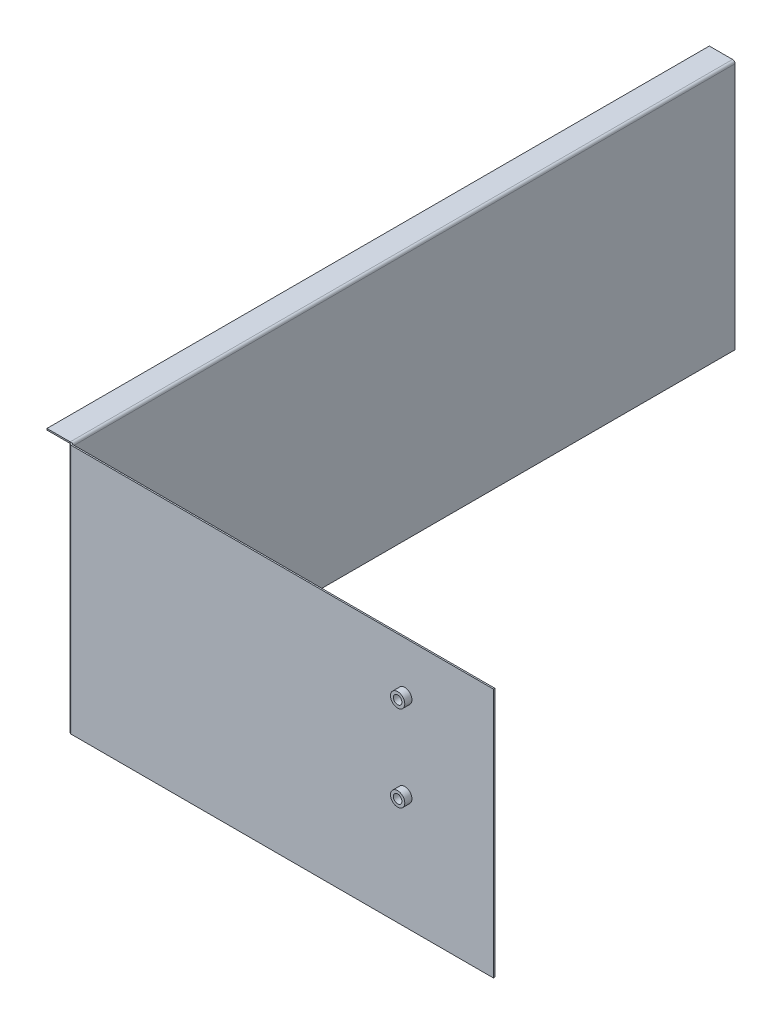
ISO-10303-21;
HEADER;
FILE_DESCRIPTION(('STEP AP214'),'2;1');
FILE_NAME('part.step','',(''),(''),'','','');
FILE_SCHEMA(('AUTOMOTIVE_DESIGN { 1 0 10303 214 1 1 1 1 }'));
ENDSEC;
DATA;
#1=APPLICATION_CONTEXT('core data for automotive mechanical design processes');
#2=APPLICATION_PROTOCOL_DEFINITION('international standard','automotive_design',2000,#1);
#3=PRODUCT_CONTEXT('',#1,'mechanical');
#4=PRODUCT('Part','Part','',(#3));
#5=PRODUCT_RELATED_PRODUCT_CATEGORY('part','',(#4));
#6=PRODUCT_DEFINITION_FORMATION('','',#4);
#7=PRODUCT_DEFINITION_CONTEXT('part definition',#1,'design');
#8=PRODUCT_DEFINITION('design','',#6,#7);
#9=PRODUCT_DEFINITION_SHAPE('','',#8);
#10=(LENGTH_UNIT() NAMED_UNIT(*) SI_UNIT(.MILLI.,.METRE.));
#11=(NAMED_UNIT(*) PLANE_ANGLE_UNIT() SI_UNIT($,.RADIAN.));
#12=(NAMED_UNIT(*) SI_UNIT($,.STERADIAN.) SOLID_ANGLE_UNIT());
#13=UNCERTAINTY_MEASURE_WITH_UNIT(LENGTH_MEASURE(1.E-05),#10,'distance_accuracy_value','');
#14=(GEOMETRIC_REPRESENTATION_CONTEXT(3) GLOBAL_UNCERTAINTY_ASSIGNED_CONTEXT((#13)) GLOBAL_UNIT_ASSIGNED_CONTEXT((#10,
#11,#12)) REPRESENTATION_CONTEXT('',''));
#15=CARTESIAN_POINT('',(0.,0.,0.));
#16=DIRECTION('',(0.,0.,1.));
#17=DIRECTION('',(1.,0.,0.));
#18=AXIS2_PLACEMENT_3D('',#15,#16,#17);
#19=CARTESIAN_POINT('',(-148.500000000001,85.7634,-1.73659999999998));
#20=DIRECTION('',(0.,0.,-1.));
#21=DIRECTION('',(0.,1.,0.));
#22=AXIS2_PLACEMENT_3D('',#19,#20,#21);
#23=PLANE('',#22);
#24=DIRECTION('',(0.,-1.,0.));
#25=VECTOR('',#24,1.);
#26=CARTESIAN_POINT('',(-147.5,-87.5,-1.7366));
#27=LINE('',#26,#25);
#28=CARTESIAN_POINT('',(-147.5,85.7634,-1.73659999999998));
#29=VERTEX_POINT('',#28);
#30=CARTESIAN_POINT('',(-147.5,87.5,-1.7366));
#31=VERTEX_POINT('',#30);
#32=EDGE_CURVE('E269',#29,#31,#27,.F.);
#33=ORIENTED_EDGE('',*,*,#32,.F.);
#34=CARTESIAN_POINT('',(-149.236600000001,85.7634,-1.73659999999998));
#35=DIRECTION('',(0.,0.,-1.));
#36=DIRECTION('',(-1.,0.,0.));
#37=AXIS2_PLACEMENT_3D('',#34,#35,#36);
#38=CIRCLE('',#37,1.7366);
#39=CARTESIAN_POINT('',(-148.5,87.3360410906494,-1.7366));
#40=VERTEX_POINT('',#39);
#41=EDGE_CURVE('E228',#29,#40,#38,.F.);
#42=ORIENTED_EDGE('',*,*,#41,.T.);
#43=DIRECTION('',(4.79481324697032E-13,1.,0.));
#44=VECTOR('',#43,1.);
#45=CARTESIAN_POINT('',(-148.500000000001,85.7634,-1.73659999999998));
#46=LINE('',#45,#44);
#47=CARTESIAN_POINT('',(-148.5,87.5,-1.7366));
#48=VERTEX_POINT('',#47);
#49=EDGE_CURVE('E243',#40,#48,#46,.T.);
#50=ORIENTED_EDGE('',*,*,#49,.T.);
#51=DIRECTION('',(-1.,0.,0.));
#52=VECTOR('',#51,1.);
#53=CARTESIAN_POINT('',(-147.5,87.5,-1.7366));
#54=LINE('',#53,#52);
#55=EDGE_CURVE('E263',#31,#48,#54,.T.);
#56=ORIENTED_EDGE('',*,*,#55,.F.);
#57=EDGE_LOOP('',(#33,#42,#50,#56));
#58=FACE_BOUND('',#57,.T.);
#59=ADVANCED_FACE('F77',(#58),#23,.T.);
#60=CARTESIAN_POINT('',(-148.5,0.,5.18704353703955E-13));
#61=DIRECTION('',(-1.,0.,0.));
#62=DIRECTION('',(0.,0.,1.));
#63=AXIS2_PLACEMENT_3D('',#60,#61,#62);
#64=PLANE('',#63);
#65=CARTESIAN_POINT('',(-148.500000000001,78.4538669843767,-402.606868807182));
#66=DIRECTION('',(-1.,0.,0.));
#67=DIRECTION('',(0.,0.,1.));
#68=AXIS2_PLACEMENT_3D('',#65,#66,#67);
#69=CIRCLE('',#68,4.79400000000002);
#70=CARTESIAN_POINT('',(-148.500000000001,78.4538669843767,-397.812868807182));
#71=VERTEX_POINT('',#70);
#72=EDGE_CURVE('E397',#71,#71,#69,.T.);
#73=ORIENTED_EDGE('',*,*,#72,.F.);
#74=EDGE_LOOP('',(#73));
#75=FACE_BOUND('',#74,.T.);
#76=CARTESIAN_POINT('',(-148.500000000001,78.4538669843767,-292.599468807182));
#77=DIRECTION('',(-1.,0.,0.));
#78=DIRECTION('',(0.,0.,1.));
#79=AXIS2_PLACEMENT_3D('',#76,#77,#78);
#80=CIRCLE('',#79,4.79399999999996);
#81=CARTESIAN_POINT('',(-148.500000000001,78.4538669843767,-287.805468807182));
#82=VERTEX_POINT('',#81);
#83=EDGE_CURVE('E388',#82,#82,#80,.T.);
#84=ORIENTED_EDGE('',*,*,#83,.F.);
#85=EDGE_LOOP('',(#84));
#86=FACE_BOUND('',#85,.T.);
#87=CARTESIAN_POINT('',(-148.500000000001,78.4538669843767,-182.592068807182));
#88=DIRECTION('',(-1.,0.,0.));
#89=DIRECTION('',(0.,0.,1.));
#90=AXIS2_PLACEMENT_3D('',#87,#88,#89);
#91=CIRCLE('',#90,4.79399999999999);
#92=CARTESIAN_POINT('',(-148.500000000001,78.4538669843767,-177.798068807182));
#93=VERTEX_POINT('',#92);
#94=EDGE_CURVE('E379',#93,#93,#91,.T.);
#95=ORIENTED_EDGE('',*,*,#94,.F.);
#96=EDGE_LOOP('',(#95));
#97=FACE_BOUND('',#96,.T.);
#98=CARTESIAN_POINT('',(-148.5,78.4538669843767,-72.5846688071817));
#99=DIRECTION('',(-1.,0.,0.));
#100=DIRECTION('',(0.,0.,1.));
#101=AXIS2_PLACEMENT_3D('',#98,#99,#100);
#102=CIRCLE('',#101,4.79400000000001);
#103=CARTESIAN_POINT('',(-148.5,78.4538669843767,-67.7906688071817));
#104=VERTEX_POINT('',#103);
#105=EDGE_CURVE('E370',#104,#104,#102,.T.);
#106=ORIENTED_EDGE('',*,*,#105,.F.);
#107=EDGE_LOOP('',(#106));
#108=FACE_BOUND('',#107,.T.);
#109=DIRECTION('',(0.,1.,0.));
#110=VECTOR('',#109,1.);
#111=CARTESIAN_POINT('',(-148.5,0.,-1.7366));
#112=LINE('',#111,#110);
#113=CARTESIAN_POINT('',(-148.5,-87.5,-1.7366));
#114=VERTEX_POINT('',#113);
#115=CARTESIAN_POINT('',(-148.500000000001,85.7634,-1.73659999999998));
#116=VERTEX_POINT('',#115);
#117=EDGE_CURVE('E260',#114,#116,#112,.T.);
#118=ORIENTED_EDGE('',*,*,#117,.T.);
#119=DIRECTION('',(0.,0.,-1.));
#120=VECTOR('',#119,1.);
#121=CARTESIAN_POINT('',(-148.500000000001,85.7634,-465.));
#122=LINE('',#121,#120);
#123=CARTESIAN_POINT('',(-148.500000000001,85.7634,-465.));
#124=VERTEX_POINT('',#123);
#125=EDGE_CURVE('E236',#124,#116,#122,.F.);
#126=ORIENTED_EDGE('',*,*,#125,.F.);
#127=DIRECTION('',(0.,1.,0.));
#128=VECTOR('',#127,1.);
#129=CARTESIAN_POINT('',(-148.500000000002,87.5,-465.));
#130=LINE('',#129,#128);
#131=CARTESIAN_POINT('',(-148.500000000002,-87.4999999999999,-465.));
#132=VERTEX_POINT('',#131);
#133=EDGE_CURVE('E252',#132,#124,#130,.T.);
#134=ORIENTED_EDGE('',*,*,#133,.F.);
#135=DIRECTION('',(0.,0.,-1.));
#136=VECTOR('',#135,1.);
#137=CARTESIAN_POINT('',(-148.500000000002,-87.4999999999999,-465.));
#138=LINE('',#137,#136);
#139=EDGE_CURVE('E254',#114,#132,#138,.T.);
#140=ORIENTED_EDGE('',*,*,#139,.F.);
#141=EDGE_LOOP('',(#118,#126,#134,#140));
#142=FACE_BOUND('',#141,.T.);
#143=ADVANCED_FACE('F351',(#75,#86,#97,#108,#142),#64,.T.);
#144=CARTESIAN_POINT('',(-147.5,0.,5.15212872365112E-13));
#145=DIRECTION('',(-1.,0.,0.));
#146=DIRECTION('',(0.,0.,1.));
#147=AXIS2_PLACEMENT_3D('',#144,#145,#146);
#148=PLANE('',#147);
#149=DIRECTION('',(0.,0.,-1.));
#150=VECTOR('',#149,1.);
#151=CARTESIAN_POINT('',(-147.500000000001,85.7634,-465.));
#152=LINE('',#151,#150);
#153=CARTESIAN_POINT('',(-147.500000000002,85.7634,-465.));
#154=VERTEX_POINT('',#153);
#155=EDGE_CURVE('E223',#154,#29,#152,.F.);
#156=ORIENTED_EDGE('',*,*,#155,.T.);
#157=CARTESIAN_POINT('',(-147.5,-87.5,-1.7366));
#158=VERTEX_POINT('',#157);
#159=EDGE_CURVE('E266',#158,#29,#27,.F.);
#160=ORIENTED_EDGE('',*,*,#159,.F.);
#161=DIRECTION('',(0.,0.,1.));
#162=VECTOR('',#161,1.);
#163=CARTESIAN_POINT('',(-147.5,-87.5,5.04744713458355E-13));
#164=LINE('',#163,#162);
#165=CARTESIAN_POINT('',(-147.500000000002,-87.4999999999999,-465.));
#166=VERTEX_POINT('',#165);
#167=EDGE_CURVE('E258',#158,#166,#164,.F.);
#168=ORIENTED_EDGE('',*,*,#167,.T.);
#169=DIRECTION('',(0.,-1.,0.));
#170=VECTOR('',#169,1.);
#171=CARTESIAN_POINT('',(-147.500000000002,0.,-465.));
#172=LINE('',#171,#170);
#173=EDGE_CURVE('E256',#166,#154,#172,.F.);
#174=ORIENTED_EDGE('',*,*,#173,.T.);
#175=EDGE_LOOP('',(#156,#160,#168,#174));
#176=FACE_BOUND('',#175,.T.);
#177=ADVANCED_FACE('F447',(#176),#148,.F.);
#178=CARTESIAN_POINT('',(-148.500000000002,87.5,-465.));
#179=DIRECTION('',(0.,0.,-1.));
#180=DIRECTION('',(-1.,0.,0.));
#181=AXIS2_PLACEMENT_3D('',#178,#179,#180);
#182=PLANE('',#181);
#183=ORIENTED_EDGE('',*,*,#133,.T.);
#184=DIRECTION('',(1.,0.,0.));
#185=VECTOR('',#184,1.);
#186=CARTESIAN_POINT('',(-148.500000000001,85.7634,-465.));
#187=LINE('',#186,#185);
#188=EDGE_CURVE('E92',#124,#154,#187,.T.);
#189=ORIENTED_EDGE('',*,*,#188,.T.);
#190=ORIENTED_EDGE('',*,*,#173,.F.);
#191=DIRECTION('',(1.,0.,0.));
#192=VECTOR('',#191,1.);
#193=CARTESIAN_POINT('',(-148.500000000002,-87.4999999999999,-465.));
#194=LINE('',#193,#192);
#195=EDGE_CURVE('E248',#132,#166,#194,.T.);
#196=ORIENTED_EDGE('',*,*,#195,.F.);
#197=EDGE_LOOP('',(#183,#189,#190,#196));
#198=FACE_BOUND('',#197,.T.);
#199=ADVANCED_FACE('F458',(#198),#182,.T.);
#200=CARTESIAN_POINT('',(-148.5,87.5,-1.));
#201=DIRECTION('',(0.,1.,0.));
#202=DIRECTION('',(0.,0.,1.));
#203=AXIS2_PLACEMENT_3D('',#200,#201,#202);
#204=PLANE('',#203);
#205=DIRECTION('',(-1.,0.,0.));
#206=VECTOR('',#205,1.);
#207=CARTESIAN_POINT('',(-148.5,87.5,-1.));
#208=LINE('',#207,#206);
#209=CARTESIAN_POINT('',(148.5,87.5,-1.));
#210=VERTEX_POINT('',#209);
#211=CARTESIAN_POINT('',(-146.7634,87.5,-1.));
#212=VERTEX_POINT('',#211);
#213=EDGE_CURVE('E295',#210,#212,#208,.T.);
#214=ORIENTED_EDGE('',*,*,#213,.T.);
#215=DIRECTION('',(0.,0.,1.));
#216=VECTOR('',#215,1.);
#217=CARTESIAN_POINT('',(-146.7634,87.5,-1.));
#218=LINE('',#217,#216);
#219=CARTESIAN_POINT('',(-146.7634,87.5,0.));
#220=VERTEX_POINT('',#219);
#221=EDGE_CURVE('E278',#212,#220,#218,.T.);
#222=ORIENTED_EDGE('',*,*,#221,.T.);
#223=DIRECTION('',(-1.,0.,0.));
#224=VECTOR('',#223,1.);
#225=CARTESIAN_POINT('',(-148.5,87.5,0.));
#226=LINE('',#225,#224);
#227=CARTESIAN_POINT('',(148.5,87.5,0.));
#228=VERTEX_POINT('',#227);
#229=EDGE_CURVE('E303',#228,#220,#226,.T.);
#230=ORIENTED_EDGE('',*,*,#229,.F.);
#231=DIRECTION('',(0.,0.,1.));
#232=VECTOR('',#231,1.);
#233=CARTESIAN_POINT('',(148.5,87.5,-1.));
#234=LINE('',#233,#232);
#235=EDGE_CURVE('E300',#210,#228,#234,.T.);
#236=ORIENTED_EDGE('',*,*,#235,.F.);
#237=EDGE_LOOP('',(#214,#222,#230,#236));
#238=FACE_BOUND('',#237,.T.);
#239=ADVANCED_FACE('F462',(#238),#204,.T.);
#240=CARTESIAN_POINT('',(0.,0.,-1.));
#241=DIRECTION('',(0.,0.,-1.));
#242=DIRECTION('',(-1.,0.,0.));
#243=AXIS2_PLACEMENT_3D('',#240,#241,#242);
#244=PLANE('',#243);
#245=DIRECTION('',(1.,0.,0.));
#246=VECTOR('',#245,1.);
#247=CARTESIAN_POINT('',(-148.5,-87.5,-1.));
#248=LINE('',#247,#246);
#249=CARTESIAN_POINT('',(-146.7634,-87.5,-1.));
#250=VERTEX_POINT('',#249);
#251=CARTESIAN_POINT('',(148.5,-87.5,-1.));
#252=VERTEX_POINT('',#251);
#253=EDGE_CURVE('E298',#250,#252,#248,.T.);
#254=ORIENTED_EDGE('',*,*,#253,.F.);
#255=DIRECTION('',(0.,1.,0.));
#256=VECTOR('',#255,1.);
#257=CARTESIAN_POINT('',(-146.7634,87.5,-1.));
#258=LINE('',#257,#256);
#259=EDGE_CURVE('E100',#212,#250,#258,.F.);
#260=ORIENTED_EDGE('',*,*,#259,.F.);
#261=ORIENTED_EDGE('',*,*,#213,.F.);
#262=DIRECTION('',(0.,1.,0.));
#263=VECTOR('',#262,1.);
#264=CARTESIAN_POINT('',(148.5,-87.5,-1.));
#265=LINE('',#264,#263);
#266=EDGE_CURVE('E292',#252,#210,#265,.T.);
#267=ORIENTED_EDGE('',*,*,#266,.F.);
#268=EDGE_LOOP('',(#254,#260,#261,#267));
#269=FACE_BOUND('',#268,.T.);
#270=ADVANCED_FACE('F330',(#269),#244,.T.);
#271=CARTESIAN_POINT('',(0.,0.,0.));
#272=DIRECTION('',(0.,0.,-1.));
#273=DIRECTION('',(-1.,0.,0.));
#274=AXIS2_PLACEMENT_3D('',#271,#272,#273);
#275=PLANE('',#274);
#276=CARTESIAN_POINT('',(86.5,-7.50000000000001,0.));
#277=DIRECTION('',(0.,0.,-1.));
#278=DIRECTION('',(-1.,0.,0.));
#279=AXIS2_PLACEMENT_3D('',#276,#277,#278);
#280=CIRCLE('',#279,5.);
#281=CARTESIAN_POINT('',(81.5,-7.50000000000001,0.));
#282=VERTEX_POINT('',#281);
#283=EDGE_CURVE('E13',#282,#282,#280,.F.);
#284=ORIENTED_EDGE('',*,*,#283,.F.);
#285=EDGE_LOOP('',(#284));
#286=FACE_BOUND('',#285,.T.);
#287=CARTESIAN_POINT('',(86.5,52.5,0.));
#288=DIRECTION('',(0.,0.,-1.));
#289=DIRECTION('',(-1.,0.,0.));
#290=AXIS2_PLACEMENT_3D('',#287,#288,#289);
#291=CIRCLE('',#290,5.00000000000001);
#292=CARTESIAN_POINT('',(81.5,52.5,0.));
#293=VERTEX_POINT('',#292);
#294=EDGE_CURVE('E85',#293,#293,#291,.F.);
#295=ORIENTED_EDGE('',*,*,#294,.F.);
#296=EDGE_LOOP('',(#295));
#297=FACE_BOUND('',#296,.T.);
#298=DIRECTION('',(0.,1.,0.));
#299=VECTOR('',#298,1.);
#300=CARTESIAN_POINT('',(-146.7634,87.5,0.));
#301=LINE('',#300,#299);
#302=CARTESIAN_POINT('',(-146.7634,-87.5,0.));
#303=VERTEX_POINT('',#302);
#304=EDGE_CURVE('E272',#220,#303,#301,.F.);
#305=ORIENTED_EDGE('',*,*,#304,.T.);
#306=DIRECTION('',(1.,0.,0.));
#307=VECTOR('',#306,1.);
#308=CARTESIAN_POINT('',(-148.5,-87.5,0.));
#309=LINE('',#308,#307);
#310=CARTESIAN_POINT('',(148.5,-87.5,0.));
#311=VERTEX_POINT('',#310);
#312=EDGE_CURVE('E296',#303,#311,#309,.T.);
#313=ORIENTED_EDGE('',*,*,#312,.T.);
#314=DIRECTION('',(0.,1.,0.));
#315=VECTOR('',#314,1.);
#316=CARTESIAN_POINT('',(148.5,-87.5,0.));
#317=LINE('',#316,#315);
#318=EDGE_CURVE('E290',#311,#228,#317,.T.);
#319=ORIENTED_EDGE('',*,*,#318,.T.);
#320=ORIENTED_EDGE('',*,*,#229,.T.);
#321=EDGE_LOOP('',(#305,#313,#319,#320));
#322=FACE_BOUND('',#321,.T.);
#323=ADVANCED_FACE('F327',(#286,#297,#322),#275,.F.);
#324=CARTESIAN_POINT('',(148.5,-87.5,-1.));
#325=DIRECTION('',(1.,0.,0.));
#326=DIRECTION('',(0.,0.,-1.));
#327=AXIS2_PLACEMENT_3D('',#324,#325,#326);
#328=PLANE('',#327);
#329=ORIENTED_EDGE('',*,*,#318,.F.);
#330=DIRECTION('',(0.,0.,1.));
#331=VECTOR('',#330,1.);
#332=CARTESIAN_POINT('',(148.5,-87.5,-1.));
#333=LINE('',#332,#331);
#334=EDGE_CURVE('E307',#252,#311,#333,.T.);
#335=ORIENTED_EDGE('',*,*,#334,.F.);
#336=ORIENTED_EDGE('',*,*,#266,.T.);
#337=ORIENTED_EDGE('',*,*,#235,.T.);
#338=EDGE_LOOP('',(#329,#335,#336,#337));
#339=FACE_BOUND('',#338,.T.);
#340=ADVANCED_FACE('F79',(#339),#328,.T.);
#341=CARTESIAN_POINT('',(-148.5,-87.5,-1.));
#342=DIRECTION('',(0.,-1.,0.));
#343=DIRECTION('',(0.,0.,-1.));
#344=AXIS2_PLACEMENT_3D('',#341,#342,#343);
#345=PLANE('',#344);
#346=DIRECTION('',(0.,0.,1.));
#347=VECTOR('',#346,1.);
#348=CARTESIAN_POINT('',(-146.7634,-87.5,-1.));
#349=LINE('',#348,#347);
#350=EDGE_CURVE('E287',#250,#303,#349,.T.);
#351=ORIENTED_EDGE('',*,*,#350,.F.);
#352=ORIENTED_EDGE('',*,*,#253,.T.);
#353=ORIENTED_EDGE('',*,*,#334,.T.);
#354=ORIENTED_EDGE('',*,*,#312,.F.);
#355=EDGE_LOOP('',(#351,#352,#353,#354));
#356=FACE_BOUND('',#355,.T.);
#357=ADVANCED_FACE('F342',(#356),#345,.T.);
#358=CARTESIAN_POINT('',(-146.7634,-87.5,-1.73660000000001));
#359=DIRECTION('',(0.,-1.,0.));
#360=DIRECTION('',(0.,0.,-1.));
#361=AXIS2_PLACEMENT_3D('',#358,#359,#360);
#362=PLANE('',#361);
#363=DIRECTION('',(-1.,0.,0.));
#364=VECTOR('',#363,1.);
#365=CARTESIAN_POINT('',(-148.5,-87.5,-1.73660000000003));
#366=LINE('',#365,#364);
#367=EDGE_CURVE('E247',#158,#114,#366,.T.);
#368=ORIENTED_EDGE('',*,*,#367,.F.);
#369=CARTESIAN_POINT('',(-146.7634,-87.5,-1.73660000000001));
#370=DIRECTION('',(0.,1.,0.));
#371=DIRECTION('',(0.,0.,1.));
#372=AXIS2_PLACEMENT_3D('',#369,#370,#371);
#373=CIRCLE('',#372,0.736600000000004);
#374=EDGE_CURVE('E281',#250,#158,#373,.F.);
#375=ORIENTED_EDGE('',*,*,#374,.F.);
#376=ORIENTED_EDGE('',*,*,#350,.T.);
#377=CARTESIAN_POINT('',(-146.7634,-87.5,-1.73660000000001));
#378=DIRECTION('',(0.,1.,0.));
#379=DIRECTION('',(0.,0.,1.));
#380=AXIS2_PLACEMENT_3D('',#377,#378,#379);
#381=CIRCLE('',#380,1.7366);
#382=EDGE_CURVE('E274',#303,#114,#381,.F.);
#383=ORIENTED_EDGE('',*,*,#382,.T.);
#384=EDGE_LOOP('',(#368,#375,#376,#383));
#385=FACE_BOUND('',#384,.T.);
#386=ADVANCED_FACE('F347',(#385),#362,.T.);
#387=CARTESIAN_POINT('',(-146.7634,87.5,-1.73660000000001));
#388=DIRECTION('',(0.,-1.,0.));
#389=DIRECTION('',(0.,0.,-1.));
#390=AXIS2_PLACEMENT_3D('',#387,#388,#389);
#391=PLANE('',#390);
#392=CARTESIAN_POINT('',(-146.7634,87.5,-1.73660000000001));
#393=DIRECTION('',(0.,1.,0.));
#394=DIRECTION('',(0.,0.,1.));
#395=AXIS2_PLACEMENT_3D('',#392,#393,#394);
#396=CIRCLE('',#395,0.736600000000004);
#397=EDGE_CURVE('E251',#31,#212,#396,.T.);
#398=ORIENTED_EDGE('',*,*,#397,.F.);
#399=ORIENTED_EDGE('',*,*,#55,.T.);
#400=CARTESIAN_POINT('',(-146.7634,87.5,-1.73660000000001));
#401=DIRECTION('',(0.,1.,0.));
#402=DIRECTION('',(0.,0.,1.));
#403=AXIS2_PLACEMENT_3D('',#400,#401,#402);
#404=CIRCLE('',#403,1.7366);
#405=EDGE_CURVE('E275',#48,#220,#404,.T.);
#406=ORIENTED_EDGE('',*,*,#405,.T.);
#407=ORIENTED_EDGE('',*,*,#221,.F.);
#408=EDGE_LOOP('',(#398,#399,#406,#407));
#409=FACE_BOUND('',#408,.T.);
#410=ADVANCED_FACE('F470',(#409),#391,.F.);
#411=CARTESIAN_POINT('',(-146.7634,87.5,-1.73660000000001));
#412=DIRECTION('',(0.,1.,0.));
#413=DIRECTION('',(-1.,0.,0.));
#414=AXIS2_PLACEMENT_3D('',#411,#412,#413);
#415=CYLINDRICAL_SURFACE('',#414,1.7366);
#416=ORIENTED_EDGE('',*,*,#304,.F.);
#417=ORIENTED_EDGE('',*,*,#405,.F.);
#418=ORIENTED_EDGE('',*,*,#49,.F.);
#419=EDGE_CURVE('E244',#116,#40,#46,.T.);
#420=ORIENTED_EDGE('',*,*,#419,.F.);
#421=ORIENTED_EDGE('',*,*,#117,.F.);
#422=ORIENTED_EDGE('',*,*,#382,.F.);
#423=EDGE_LOOP('',(#416,#417,#418,#420,#421,#422));
#424=FACE_BOUND('',#423,.T.);
#425=ADVANCED_FACE('F348',(#424),#415,.T.);
#426=CARTESIAN_POINT('',(-146.7634,87.5,-1.73660000000001));
#427=DIRECTION('',(0.,1.,0.));
#428=DIRECTION('',(-1.,0.,0.));
#429=AXIS2_PLACEMENT_3D('',#426,#427,#428);
#430=CYLINDRICAL_SURFACE('',#429,0.736600000000004);
#431=ORIENTED_EDGE('',*,*,#259,.T.);
#432=ORIENTED_EDGE('',*,*,#374,.T.);
#433=ORIENTED_EDGE('',*,*,#159,.T.);
#434=ORIENTED_EDGE('',*,*,#32,.T.);
#435=ORIENTED_EDGE('',*,*,#397,.T.);
#436=EDGE_LOOP('',(#431,#432,#433,#434,#435));
#437=FACE_BOUND('',#436,.T.);
#438=ADVANCED_FACE('F466',(#437),#430,.F.);
#439=CARTESIAN_POINT('',(-148.500000000002,-87.4999999999999,-465.));
#440=DIRECTION('',(0.,-1.,0.));
#441=DIRECTION('',(0.,0.,-1.));
#442=AXIS2_PLACEMENT_3D('',#439,#440,#441);
#443=PLANE('',#442);
#444=ORIENTED_EDGE('',*,*,#167,.F.);
#445=ORIENTED_EDGE('',*,*,#367,.T.);
#446=ORIENTED_EDGE('',*,*,#139,.T.);
#447=ORIENTED_EDGE('',*,*,#195,.T.);
#448=EDGE_LOOP('',(#444,#445,#446,#447));
#449=FACE_BOUND('',#448,.T.);
#450=ADVANCED_FACE('F463',(#449),#443,.T.);
#451=CARTESIAN_POINT('',(-149.236600000001,85.7634,-1.73659999999998));
#452=DIRECTION('',(0.,0.,1.));
#453=DIRECTION('',(1.,0.,0.));
#454=AXIS2_PLACEMENT_3D('',#451,#452,#453);
#455=PLANE('',#454);
#456=CARTESIAN_POINT('',(-149.236600000001,85.7634,-1.73659999999998));
#457=DIRECTION('',(0.,0.,-1.));
#458=DIRECTION('',(-1.,0.,0.));
#459=AXIS2_PLACEMENT_3D('',#456,#457,#458);
#460=CIRCLE('',#459,0.736600000000004);
#461=CARTESIAN_POINT('',(-149.236600000001,86.5,-1.73659999999998));
#462=VERTEX_POINT('',#461);
#463=EDGE_CURVE('E233',#116,#462,#460,.F.);
#464=ORIENTED_EDGE('',*,*,#463,.F.);
#465=ORIENTED_EDGE('',*,*,#419,.T.);
#466=CARTESIAN_POINT('',(-149.236600000001,87.5,-1.73659999999998));
#467=VERTEX_POINT('',#466);
#468=EDGE_CURVE('E226',#40,#467,#38,.F.);
#469=ORIENTED_EDGE('',*,*,#468,.T.);
#470=DIRECTION('',(0.,-1.,0.));
#471=VECTOR('',#470,1.);
#472=CARTESIAN_POINT('',(-149.2366,87.5,-1.7366));
#473=LINE('',#472,#471);
#474=EDGE_CURVE('E203',#462,#467,#473,.F.);
#475=ORIENTED_EDGE('',*,*,#474,.F.);
#476=EDGE_LOOP('',(#464,#465,#469,#475));
#477=FACE_BOUND('',#476,.T.);
#478=ADVANCED_FACE('F359',(#477),#455,.T.);
#479=CARTESIAN_POINT('',(-149.236600000001,85.7634,-465.));
#480=DIRECTION('',(0.,0.,1.));
#481=DIRECTION('',(1.,0.,0.));
#482=AXIS2_PLACEMENT_3D('',#479,#480,#481);
#483=PLANE('',#482);
#484=CARTESIAN_POINT('',(-149.236600000001,85.7634,-465.));
#485=DIRECTION('',(0.,0.,-1.));
#486=DIRECTION('',(-1.,0.,0.));
#487=AXIS2_PLACEMENT_3D('',#484,#485,#486);
#488=CIRCLE('',#487,0.736600000000004);
#489=CARTESIAN_POINT('',(-149.236600000001,86.5,-465.));
#490=VERTEX_POINT('',#489);
#491=EDGE_CURVE('E239',#490,#124,#488,.T.);
#492=ORIENTED_EDGE('',*,*,#491,.F.);
#493=DIRECTION('',(0.,-1.,0.));
#494=VECTOR('',#493,1.);
#495=CARTESIAN_POINT('',(-149.236600000002,86.5,-465.));
#496=LINE('',#495,#494);
#497=CARTESIAN_POINT('',(-149.236600000002,87.5,-465.));
#498=VERTEX_POINT('',#497);
#499=EDGE_CURVE('E216',#490,#498,#496,.F.);
#500=ORIENTED_EDGE('',*,*,#499,.T.);
#501=CARTESIAN_POINT('',(-149.236600000001,85.7634,-465.));
#502=DIRECTION('',(0.,0.,-1.));
#503=DIRECTION('',(-1.,0.,0.));
#504=AXIS2_PLACEMENT_3D('',#501,#502,#503);
#505=CIRCLE('',#504,1.7366);
#506=EDGE_CURVE('E227',#498,#154,#505,.T.);
#507=ORIENTED_EDGE('',*,*,#506,.T.);
#508=ORIENTED_EDGE('',*,*,#188,.F.);
#509=EDGE_LOOP('',(#492,#500,#507,#508));
#510=FACE_BOUND('',#509,.T.);
#511=ADVANCED_FACE('F453',(#510),#483,.F.);
#512=CARTESIAN_POINT('',(-149.236600000001,85.7634,-465.));
#513=DIRECTION('',(0.,0.,-1.));
#514=DIRECTION('',(0.,1.,0.));
#515=AXIS2_PLACEMENT_3D('',#512,#513,#514);
#516=CYLINDRICAL_SURFACE('',#515,1.7366);
#517=ORIENTED_EDGE('',*,*,#155,.F.);
#518=ORIENTED_EDGE('',*,*,#506,.F.);
#519=DIRECTION('',(0.,0.,-1.));
#520=VECTOR('',#519,1.);
#521=CARTESIAN_POINT('',(-149.2366,87.5,-1.73659999999997));
#522=LINE('',#521,#520);
#523=EDGE_CURVE('E213',#498,#467,#522,.F.);
#524=ORIENTED_EDGE('',*,*,#523,.T.);
#525=ORIENTED_EDGE('',*,*,#468,.F.);
#526=ORIENTED_EDGE('',*,*,#41,.F.);
#527=EDGE_LOOP('',(#517,#518,#524,#525,#526));
#528=FACE_BOUND('',#527,.T.);
#529=ADVANCED_FACE('F364',(#528),#516,.T.);
#530=CARTESIAN_POINT('',(-149.236600000001,85.7634,-465.));
#531=DIRECTION('',(0.,0.,-1.));
#532=DIRECTION('',(0.,1.,0.));
#533=AXIS2_PLACEMENT_3D('',#530,#531,#532);
#534=CYLINDRICAL_SURFACE('',#533,0.736600000000004);
#535=ORIENTED_EDGE('',*,*,#125,.T.);
#536=ORIENTED_EDGE('',*,*,#463,.T.);
#537=DIRECTION('',(0.,0.,-1.));
#538=VECTOR('',#537,1.);
#539=CARTESIAN_POINT('',(-149.2366,86.5,-1.73659999999997));
#540=LINE('',#539,#538);
#541=EDGE_CURVE('E219',#462,#490,#540,.T.);
#542=ORIENTED_EDGE('',*,*,#541,.T.);
#543=ORIENTED_EDGE('',*,*,#491,.T.);
#544=EDGE_LOOP('',(#535,#536,#542,#543));
#545=FACE_BOUND('',#544,.T.);
#546=ADVANCED_FACE('F355',(#545),#534,.F.);
#547=CARTESIAN_POINT('',(-165.500000000002,87.5000000000001,-465.));
#548=DIRECTION('',(0.,0.,1.));
#549=DIRECTION('',(1.,0.,0.));
#550=AXIS2_PLACEMENT_3D('',#547,#548,#549);
#551=PLANE('',#550);
#552=ORIENTED_EDGE('',*,*,#499,.F.);
#553=DIRECTION('',(1.,0.,0.));
#554=VECTOR('',#553,1.);
#555=CARTESIAN_POINT('',(-165.500000000002,86.5,-465.));
#556=LINE('',#555,#554);
#557=CARTESIAN_POINT('',(-165.500000000002,86.5,-465.));
#558=VERTEX_POINT('',#557);
#559=EDGE_CURVE('E211',#490,#558,#556,.F.);
#560=ORIENTED_EDGE('',*,*,#559,.T.);
#561=DIRECTION('',(0.,-1.,0.));
#562=VECTOR('',#561,1.);
#563=CARTESIAN_POINT('',(-165.500000000002,87.5000000000001,-465.));
#564=LINE('',#563,#562);
#565=CARTESIAN_POINT('',(-165.500000000002,87.5000000000001,-465.));
#566=VERTEX_POINT('',#565);
#567=EDGE_CURVE('E199',#566,#558,#564,.T.);
#568=ORIENTED_EDGE('',*,*,#567,.F.);
#569=DIRECTION('',(-1.,0.,0.));
#570=VECTOR('',#569,1.);
#571=CARTESIAN_POINT('',(-1.2291826121788E-12,87.4999999999995,-465.000000000001));
#572=LINE('',#571,#570);
#573=EDGE_CURVE('E186',#498,#566,#572,.T.);
#574=ORIENTED_EDGE('',*,*,#573,.F.);
#575=EDGE_LOOP('',(#552,#560,#568,#574));
#576=FACE_BOUND('',#575,.T.);
#577=ADVANCED_FACE('F367',(#576),#551,.F.);
#578=CARTESIAN_POINT('',(-148.5,87.5,-1.7366));
#579=DIRECTION('',(0.,0.,-1.));
#580=DIRECTION('',(-1.,0.,0.));
#581=AXIS2_PLACEMENT_3D('',#578,#579,#580);
#582=PLANE('',#581);
#583=ORIENTED_EDGE('',*,*,#474,.T.);
#584=DIRECTION('',(1.,0.,0.));
#585=VECTOR('',#584,1.);
#586=CARTESIAN_POINT('',(2.829197898534E-13,87.4999999999995,-1.73660000000054));
#587=LINE('',#586,#585);
#588=CARTESIAN_POINT('',(-165.5,87.5000000000001,-1.73659999999994));
#589=VERTEX_POINT('',#588);
#590=EDGE_CURVE('E184',#589,#467,#587,.T.);
#591=ORIENTED_EDGE('',*,*,#590,.F.);
#592=DIRECTION('',(0.,-1.,0.));
#593=VECTOR('',#592,1.);
#594=CARTESIAN_POINT('',(-165.5,87.5000000000001,-1.73659999999994));
#595=LINE('',#594,#593);
#596=CARTESIAN_POINT('',(-165.5,86.5,-1.73659999999994));
#597=VERTEX_POINT('',#596);
#598=EDGE_CURVE('E192',#589,#597,#595,.T.);
#599=ORIENTED_EDGE('',*,*,#598,.T.);
#600=DIRECTION('',(-1.,0.,0.));
#601=VECTOR('',#600,1.);
#602=CARTESIAN_POINT('',(-148.5,86.5,-1.7366));
#603=LINE('',#602,#601);
#604=EDGE_CURVE('E208',#597,#462,#603,.F.);
#605=ORIENTED_EDGE('',*,*,#604,.T.);
#606=EDGE_LOOP('',(#583,#591,#599,#605));
#607=FACE_BOUND('',#606,.T.);
#608=ADVANCED_FACE('F202',(#607),#582,.F.);
#609=CARTESIAN_POINT('',(2.89210642087962E-13,87.4999999999995,0.));
#610=DIRECTION('',(0.,-1.,0.));
#611=DIRECTION('',(1.,0.,0.));
#612=AXIS2_PLACEMENT_3D('',#609,#610,#611);
#613=PLANE('',#612);
#614=ORIENTED_EDGE('',*,*,#523,.F.);
#615=ORIENTED_EDGE('',*,*,#573,.T.);
#616=DIRECTION('',(0.,0.,1.));
#617=VECTOR('',#616,1.);
#618=CARTESIAN_POINT('',(-165.5,87.5000000000001,5.75106452040938E-13));
#619=LINE('',#618,#617);
#620=EDGE_CURVE('E179',#566,#589,#619,.T.);
#621=ORIENTED_EDGE('',*,*,#620,.T.);
#622=ORIENTED_EDGE('',*,*,#590,.T.);
#623=EDGE_LOOP('',(#614,#615,#621,#622));
#624=FACE_BOUND('',#623,.T.);
#625=ADVANCED_FACE('F182',(#624),#613,.F.);
#626=CARTESIAN_POINT('',(2.85719160749119E-13,86.4999999999995,0.));
#627=DIRECTION('',(0.,-1.,0.));
#628=DIRECTION('',(1.,0.,0.));
#629=AXIS2_PLACEMENT_3D('',#626,#627,#628);
#630=PLANE('',#629);
#631=ORIENTED_EDGE('',*,*,#559,.F.);
#632=ORIENTED_EDGE('',*,*,#541,.F.);
#633=ORIENTED_EDGE('',*,*,#604,.F.);
#634=DIRECTION('',(0.,0.,-1.));
#635=VECTOR('',#634,1.);
#636=CARTESIAN_POINT('',(-165.5,86.5,-1.73659999999994));
#637=LINE('',#636,#635);
#638=EDGE_CURVE('E195',#558,#597,#637,.F.);
#639=ORIENTED_EDGE('',*,*,#638,.F.);
#640=EDGE_LOOP('',(#631,#632,#633,#639));
#641=FACE_BOUND('',#640,.T.);
#642=ADVANCED_FACE('F509',(#641),#630,.T.);
#643=CARTESIAN_POINT('',(-165.5,87.5000000000001,-1.73659999999994));
#644=DIRECTION('',(1.,0.,0.));
#645=DIRECTION('',(0.,1.,0.));
#646=AXIS2_PLACEMENT_3D('',#643,#644,#645);
#647=PLANE('',#646);
#648=ORIENTED_EDGE('',*,*,#638,.T.);
#649=ORIENTED_EDGE('',*,*,#598,.F.);
#650=ORIENTED_EDGE('',*,*,#620,.F.);
#651=ORIENTED_EDGE('',*,*,#567,.T.);
#652=EDGE_LOOP('',(#648,#649,#650,#651));
#653=FACE_BOUND('',#652,.T.);
#654=ADVANCED_FACE('F193',(#653),#647,.F.);
#655=CARTESIAN_POINT('',(-166.5,78.4538669843767,-72.5846688071817));
#656=DIRECTION('',(-1.,0.,0.));
#657=DIRECTION('',(0.,0.,1.));
#658=AXIS2_PLACEMENT_3D('',#655,#656,#657);
#659=PLANE('',#658);
#660=CARTESIAN_POINT('',(-166.5,78.4538669843767,-72.5846688071817));
#661=DIRECTION('',(-1.,0.,0.));
#662=DIRECTION('',(0.,0.,1.));
#663=AXIS2_PLACEMENT_3D('',#660,#661,#662);
#664=CIRCLE('',#663,4.79400000000001);
#665=CARTESIAN_POINT('',(-166.5,78.4538669843767,-67.7906688071817));
#666=VERTEX_POINT('',#665);
#667=EDGE_CURVE('E222',#666,#666,#664,.T.);
#668=ORIENTED_EDGE('',*,*,#667,.T.);
#669=EDGE_LOOP('',(#668));
#670=FACE_BOUND('',#669,.T.);
#671=CARTESIAN_POINT('',(-166.5,78.4538669843767,-72.5846688071817));
#672=DIRECTION('',(-1.,0.,0.));
#673=DIRECTION('',(0.,0.,1.));
#674=AXIS2_PLACEMENT_3D('',#671,#672,#673);
#675=CIRCLE('',#674,2.794);
#676=CARTESIAN_POINT('',(-166.5,78.4538669843767,-69.7906688071817));
#677=VERTEX_POINT('',#676);
#678=EDGE_CURVE('E373',#677,#677,#675,.T.);
#679=ORIENTED_EDGE('',*,*,#678,.F.);
#680=EDGE_LOOP('',(#679));
#681=FACE_BOUND('',#680,.T.);
#682=ADVANCED_FACE('F508',(#670,#681),#659,.T.);
#683=CARTESIAN_POINT('',(-166.5,78.4538669843767,-72.5846688071817));
#684=DIRECTION('',(1.,0.,0.));
#685=DIRECTION('',(0.,0.,-1.));
#686=AXIS2_PLACEMENT_3D('',#683,#684,#685);
#687=CYLINDRICAL_SURFACE('',#686,4.79400000000001);
#688=ORIENTED_EDGE('',*,*,#667,.F.);
#689=EDGE_LOOP('',(#688));
#690=FACE_BOUND('',#689,.T.);
#691=ORIENTED_EDGE('',*,*,#105,.T.);
#692=EDGE_LOOP('',(#691));
#693=FACE_BOUND('',#692,.T.);
#694=ADVANCED_FACE('F517',(#690,#693),#687,.T.);
#695=CARTESIAN_POINT('',(-166.5,78.4538669843767,-72.5846688071817));
#696=DIRECTION('',(1.,0.,0.));
#697=DIRECTION('',(0.,0.,-1.));
#698=AXIS2_PLACEMENT_3D('',#695,#696,#697);
#699=CYLINDRICAL_SURFACE('',#698,2.794);
#700=ORIENTED_EDGE('',*,*,#678,.T.);
#701=EDGE_LOOP('',(#700));
#702=FACE_BOUND('',#701,.T.);
#703=CARTESIAN_POINT('',(-148.5,78.4538669843767,-72.5846688071817));
#704=DIRECTION('',(-1.,0.,0.));
#705=DIRECTION('',(0.,0.,1.));
#706=AXIS2_PLACEMENT_3D('',#703,#704,#705);
#707=CIRCLE('',#706,2.794);
#708=CARTESIAN_POINT('',(-148.5,78.4538669843767,-69.7906688071817));
#709=VERTEX_POINT('',#708);
#710=EDGE_CURVE('E310',#709,#709,#707,.F.);
#711=ORIENTED_EDGE('',*,*,#710,.T.);
#712=EDGE_LOOP('',(#711));
#713=FACE_BOUND('',#712,.T.);
#714=ADVANCED_FACE('F520',(#702,#713),#699,.F.);
#715=ORIENTED_EDGE('',*,*,#710,.F.);
#716=EDGE_LOOP('',(#715));
#717=FACE_BOUND('',#716,.T.);
#718=ADVANCED_FACE('F451',(#717),#64,.T.);
#719=CARTESIAN_POINT('',(-166.500000000001,78.4538669843767,-182.592068807182));
#720=DIRECTION('',(-1.,0.,0.));
#721=DIRECTION('',(0.,0.,1.));
#722=AXIS2_PLACEMENT_3D('',#719,#720,#721);
#723=PLANE('',#722);
#724=CARTESIAN_POINT('',(-166.500000000001,78.4538669843767,-182.592068807182));
#725=DIRECTION('',(-1.,0.,0.));
#726=DIRECTION('',(0.,0.,1.));
#727=AXIS2_PLACEMENT_3D('',#724,#725,#726);
#728=CIRCLE('',#727,4.79399999999999);
#729=CARTESIAN_POINT('',(-166.500000000001,78.4538669843767,-177.798068807182));
#730=VERTEX_POINT('',#729);
#731=EDGE_CURVE('E378',#730,#730,#728,.T.);
#732=ORIENTED_EDGE('',*,*,#731,.T.);
#733=EDGE_LOOP('',(#732));
#734=FACE_BOUND('',#733,.T.);
#735=CARTESIAN_POINT('',(-166.500000000001,78.4538669843767,-182.592068807182));
#736=DIRECTION('',(-1.,0.,0.));
#737=DIRECTION('',(0.,0.,1.));
#738=AXIS2_PLACEMENT_3D('',#735,#736,#737);
#739=CIRCLE('',#738,2.79399999999999);
#740=CARTESIAN_POINT('',(-166.500000000001,78.4538669843767,-179.798068807182));
#741=VERTEX_POINT('',#740);
#742=EDGE_CURVE('E382',#741,#741,#739,.T.);
#743=ORIENTED_EDGE('',*,*,#742,.F.);
#744=EDGE_LOOP('',(#743));
#745=FACE_BOUND('',#744,.T.);
#746=ADVANCED_FACE('F532',(#734,#745),#723,.T.);
#747=CARTESIAN_POINT('',(-166.500000000001,78.4538669843767,-182.592068807182));
#748=DIRECTION('',(1.,0.,0.));
#749=DIRECTION('',(0.,0.,-1.));
#750=AXIS2_PLACEMENT_3D('',#747,#748,#749);
#751=CYLINDRICAL_SURFACE('',#750,4.79399999999999);
#752=ORIENTED_EDGE('',*,*,#731,.F.);
#753=EDGE_LOOP('',(#752));
#754=FACE_BOUND('',#753,.T.);
#755=ORIENTED_EDGE('',*,*,#94,.T.);
#756=EDGE_LOOP('',(#755));
#757=FACE_BOUND('',#756,.T.);
#758=ADVANCED_FACE('F528',(#754,#757),#751,.T.);
#759=CARTESIAN_POINT('',(-166.500000000001,78.4538669843767,-182.592068807182));
#760=DIRECTION('',(1.,0.,0.));
#761=DIRECTION('',(0.,0.,-1.));
#762=AXIS2_PLACEMENT_3D('',#759,#760,#761);
#763=CYLINDRICAL_SURFACE('',#762,2.79399999999999);
#764=ORIENTED_EDGE('',*,*,#742,.T.);
#765=EDGE_LOOP('',(#764));
#766=FACE_BOUND('',#765,.T.);
#767=CARTESIAN_POINT('',(-148.500000000001,78.4538669843767,-182.592068807182));
#768=DIRECTION('',(-1.,0.,0.));
#769=DIRECTION('',(0.,0.,1.));
#770=AXIS2_PLACEMENT_3D('',#767,#768,#769);
#771=CIRCLE('',#770,2.79399999999999);
#772=CARTESIAN_POINT('',(-148.500000000001,78.4538669843767,-179.798068807182));
#773=VERTEX_POINT('',#772);
#774=EDGE_CURVE('E314',#773,#773,#771,.F.);
#775=ORIENTED_EDGE('',*,*,#774,.T.);
#776=EDGE_LOOP('',(#775));
#777=FACE_BOUND('',#776,.T.);
#778=ADVANCED_FACE('F531',(#766,#777),#763,.F.);
#779=ORIENTED_EDGE('',*,*,#774,.F.);
#780=EDGE_LOOP('',(#779));
#781=FACE_BOUND('',#780,.T.);
#782=ADVANCED_FACE('F539',(#781),#64,.T.);
#783=CARTESIAN_POINT('',(-166.500000000001,78.4538669843767,-292.599468807182));
#784=DIRECTION('',(-1.,0.,0.));
#785=DIRECTION('',(0.,0.,1.));
#786=AXIS2_PLACEMENT_3D('',#783,#784,#785);
#787=PLANE('',#786);
#788=CARTESIAN_POINT('',(-166.500000000001,78.4538669843767,-292.599468807182));
#789=DIRECTION('',(-1.,0.,0.));
#790=DIRECTION('',(0.,0.,1.));
#791=AXIS2_PLACEMENT_3D('',#788,#789,#790);
#792=CIRCLE('',#791,4.79399999999996);
#793=CARTESIAN_POINT('',(-166.500000000001,78.4538669843767,-287.805468807182));
#794=VERTEX_POINT('',#793);
#795=EDGE_CURVE('E387',#794,#794,#792,.T.);
#796=ORIENTED_EDGE('',*,*,#795,.T.);
#797=EDGE_LOOP('',(#796));
#798=FACE_BOUND('',#797,.T.);
#799=CARTESIAN_POINT('',(-166.500000000001,78.4538669843767,-292.599468807182));
#800=DIRECTION('',(-1.,0.,0.));
#801=DIRECTION('',(0.,0.,1.));
#802=AXIS2_PLACEMENT_3D('',#799,#800,#801);
#803=CIRCLE('',#802,2.79399999999998);
#804=CARTESIAN_POINT('',(-166.500000000001,78.4538669843767,-289.805468807182));
#805=VERTEX_POINT('',#804);
#806=EDGE_CURVE('E391',#805,#805,#803,.T.);
#807=ORIENTED_EDGE('',*,*,#806,.F.);
#808=EDGE_LOOP('',(#807));
#809=FACE_BOUND('',#808,.T.);
#810=ADVANCED_FACE('F545',(#798,#809),#787,.T.);
#811=CARTESIAN_POINT('',(-166.500000000001,78.4538669843767,-292.599468807182));
#812=DIRECTION('',(1.,0.,0.));
#813=DIRECTION('',(0.,0.,-1.));
#814=AXIS2_PLACEMENT_3D('',#811,#812,#813);
#815=CYLINDRICAL_SURFACE('',#814,4.79399999999996);
#816=ORIENTED_EDGE('',*,*,#795,.F.);
#817=EDGE_LOOP('',(#816));
#818=FACE_BOUND('',#817,.T.);
#819=ORIENTED_EDGE('',*,*,#83,.T.);
#820=EDGE_LOOP('',(#819));
#821=FACE_BOUND('',#820,.T.);
#822=ADVANCED_FACE('F541',(#818,#821),#815,.T.);
#823=CARTESIAN_POINT('',(-166.500000000001,78.4538669843767,-292.599468807182));
#824=DIRECTION('',(1.,0.,0.));
#825=DIRECTION('',(0.,0.,-1.));
#826=AXIS2_PLACEMENT_3D('',#823,#824,#825);
#827=CYLINDRICAL_SURFACE('',#826,2.79399999999998);
#828=ORIENTED_EDGE('',*,*,#806,.T.);
#829=EDGE_LOOP('',(#828));
#830=FACE_BOUND('',#829,.T.);
#831=CARTESIAN_POINT('',(-148.500000000001,78.4538669843767,-292.599468807182));
#832=DIRECTION('',(-1.,0.,0.));
#833=DIRECTION('',(0.,0.,1.));
#834=AXIS2_PLACEMENT_3D('',#831,#832,#833);
#835=CIRCLE('',#834,2.79399999999998);
#836=CARTESIAN_POINT('',(-148.500000000001,78.4538669843767,-289.805468807182));
#837=VERTEX_POINT('',#836);
#838=EDGE_CURVE('E317',#837,#837,#835,.F.);
#839=ORIENTED_EDGE('',*,*,#838,.T.);
#840=EDGE_LOOP('',(#839));
#841=FACE_BOUND('',#840,.T.);
#842=ADVANCED_FACE('F544',(#830,#841),#827,.F.);
#843=ORIENTED_EDGE('',*,*,#838,.F.);
#844=EDGE_LOOP('',(#843));
#845=FACE_BOUND('',#844,.T.);
#846=ADVANCED_FACE('F552',(#845),#64,.T.);
#847=CARTESIAN_POINT('',(-166.500000000001,78.4538669843767,-402.606868807182));
#848=DIRECTION('',(-1.,0.,0.));
#849=DIRECTION('',(0.,0.,1.));
#850=AXIS2_PLACEMENT_3D('',#847,#848,#849);
#851=PLANE('',#850);
#852=CARTESIAN_POINT('',(-166.500000000001,78.4538669843767,-402.606868807182));
#853=DIRECTION('',(-1.,0.,0.));
#854=DIRECTION('',(0.,0.,1.));
#855=AXIS2_PLACEMENT_3D('',#852,#853,#854);
#856=CIRCLE('',#855,4.79400000000002);
#857=CARTESIAN_POINT('',(-166.500000000001,78.4538669843767,-397.812868807182));
#858=VERTEX_POINT('',#857);
#859=EDGE_CURVE('E396',#858,#858,#856,.T.);
#860=ORIENTED_EDGE('',*,*,#859,.T.);
#861=EDGE_LOOP('',(#860));
#862=FACE_BOUND('',#861,.T.);
#863=CARTESIAN_POINT('',(-166.500000000001,78.4538669843767,-402.606868807182));
#864=DIRECTION('',(-1.,0.,0.));
#865=DIRECTION('',(0.,0.,1.));
#866=AXIS2_PLACEMENT_3D('',#863,#864,#865);
#867=CIRCLE('',#866,2.79400000000003);
#868=CARTESIAN_POINT('',(-166.500000000001,78.4538669843767,-399.812868807182));
#869=VERTEX_POINT('',#868);
#870=EDGE_CURVE('E400',#869,#869,#867,.T.);
#871=ORIENTED_EDGE('',*,*,#870,.F.);
#872=EDGE_LOOP('',(#871));
#873=FACE_BOUND('',#872,.T.);
#874=ADVANCED_FACE('F558',(#862,#873),#851,.T.);
#875=CARTESIAN_POINT('',(-166.500000000001,78.4538669843767,-402.606868807182));
#876=DIRECTION('',(1.,0.,0.));
#877=DIRECTION('',(0.,0.,-1.));
#878=AXIS2_PLACEMENT_3D('',#875,#876,#877);
#879=CYLINDRICAL_SURFACE('',#878,4.79400000000002);
#880=ORIENTED_EDGE('',*,*,#859,.F.);
#881=EDGE_LOOP('',(#880));
#882=FACE_BOUND('',#881,.T.);
#883=ORIENTED_EDGE('',*,*,#72,.T.);
#884=EDGE_LOOP('',(#883));
#885=FACE_BOUND('',#884,.T.);
#886=ADVANCED_FACE('F554',(#882,#885),#879,.T.);
#887=CARTESIAN_POINT('',(-166.500000000001,78.4538669843767,-402.606868807182));
#888=DIRECTION('',(1.,0.,0.));
#889=DIRECTION('',(0.,0.,-1.));
#890=AXIS2_PLACEMENT_3D('',#887,#888,#889);
#891=CYLINDRICAL_SURFACE('',#890,2.79400000000003);
#892=ORIENTED_EDGE('',*,*,#870,.T.);
#893=EDGE_LOOP('',(#892));
#894=FACE_BOUND('',#893,.T.);
#895=CARTESIAN_POINT('',(-148.500000000001,78.4538669843767,-402.606868807182));
#896=DIRECTION('',(-1.,0.,0.));
#897=DIRECTION('',(0.,0.,1.));
#898=AXIS2_PLACEMENT_3D('',#895,#896,#897);
#899=CIRCLE('',#898,2.79400000000003);
#900=CARTESIAN_POINT('',(-148.500000000001,78.4538669843767,-399.812868807182));
#901=VERTEX_POINT('',#900);
#902=EDGE_CURVE('E320',#901,#901,#899,.F.);
#903=ORIENTED_EDGE('',*,*,#902,.T.);
#904=EDGE_LOOP('',(#903));
#905=FACE_BOUND('',#904,.T.);
#906=ADVANCED_FACE('F557',(#894,#905),#891,.F.);
#907=ORIENTED_EDGE('',*,*,#902,.F.);
#908=EDGE_LOOP('',(#907));
#909=FACE_BOUND('',#908,.T.);
#910=ADVANCED_FACE('F450',(#909),#64,.T.);
#911=CARTESIAN_POINT('',(86.5,52.5,5.));
#912=DIRECTION('',(0.,0.,1.));
#913=DIRECTION('',(1.,0.,0.));
#914=AXIS2_PLACEMENT_3D('',#911,#912,#913);
#915=PLANE('',#914);
#916=CARTESIAN_POINT('',(86.5,52.5,5.));
#917=DIRECTION('',(0.,0.,1.));
#918=DIRECTION('',(1.,0.,0.));
#919=AXIS2_PLACEMENT_3D('',#916,#917,#918);
#920=CIRCLE('',#919,5.00000000000001);
#921=CARTESIAN_POINT('',(91.5,52.5,5.));
#922=VERTEX_POINT('',#921);
#923=EDGE_CURVE('E405',#922,#922,#920,.T.);
#924=ORIENTED_EDGE('',*,*,#923,.T.);
#925=EDGE_LOOP('',(#924));
#926=FACE_BOUND('',#925,.T.);
#927=CARTESIAN_POINT('',(86.5,52.5,5.));
#928=DIRECTION('',(0.,0.,1.));
#929=DIRECTION('',(1.,0.,0.));
#930=AXIS2_PLACEMENT_3D('',#927,#928,#929);
#931=CIRCLE('',#930,3.00000000000001);
#932=CARTESIAN_POINT('',(89.5,52.5,5.));
#933=VERTEX_POINT('',#932);
#934=EDGE_CURVE('E408',#933,#933,#931,.T.);
#935=ORIENTED_EDGE('',*,*,#934,.F.);
#936=EDGE_LOOP('',(#935));
#937=FACE_BOUND('',#936,.T.);
#938=ADVANCED_FACE('F568',(#926,#937),#915,.T.);
#939=CARTESIAN_POINT('',(86.5,52.5,5.));
#940=DIRECTION('',(0.,0.,-1.));
#941=DIRECTION('',(-1.,0.,0.));
#942=AXIS2_PLACEMENT_3D('',#939,#940,#941);
#943=CYLINDRICAL_SURFACE('',#942,5.00000000000001);
#944=ORIENTED_EDGE('',*,*,#923,.F.);
#945=EDGE_LOOP('',(#944));
#946=FACE_BOUND('',#945,.T.);
#947=ORIENTED_EDGE('',*,*,#294,.T.);
#948=EDGE_LOOP('',(#947));
#949=FACE_BOUND('',#948,.T.);
#950=ADVANCED_FACE('F325',(#946,#949),#943,.T.);
#951=CARTESIAN_POINT('',(86.5,52.5,5.));
#952=DIRECTION('',(0.,0.,-1.));
#953=DIRECTION('',(-1.,0.,0.));
#954=AXIS2_PLACEMENT_3D('',#951,#952,#953);
#955=CYLINDRICAL_SURFACE('',#954,3.00000000000001);
#956=ORIENTED_EDGE('',*,*,#934,.T.);
#957=EDGE_LOOP('',(#956));
#958=FACE_BOUND('',#957,.T.);
#959=CARTESIAN_POINT('',(86.5,52.5,0.));
#960=DIRECTION('',(0.,0.,1.));
#961=DIRECTION('',(1.,0.,0.));
#962=AXIS2_PLACEMENT_3D('',#959,#960,#961);
#963=CIRCLE('',#962,3.00000000000001);
#964=CARTESIAN_POINT('',(89.5,52.5,0.));
#965=VERTEX_POINT('',#964);
#966=EDGE_CURVE('E409',#965,#965,#963,.T.);
#967=ORIENTED_EDGE('',*,*,#966,.F.);
#968=EDGE_LOOP('',(#967));
#969=FACE_BOUND('',#968,.T.);
#970=ADVANCED_FACE('F438',(#958,#969),#955,.F.);
#971=ORIENTED_EDGE('',*,*,#966,.T.);
#972=EDGE_LOOP('',(#971));
#973=FACE_BOUND('',#972,.T.);
#974=ADVANCED_FACE('F334',(#973),#275,.F.);
#975=CARTESIAN_POINT('',(86.5,-7.50000000000001,5.));
#976=DIRECTION('',(0.,0.,1.));
#977=DIRECTION('',(1.,0.,0.));
#978=AXIS2_PLACEMENT_3D('',#975,#976,#977);
#979=PLANE('',#978);
#980=CARTESIAN_POINT('',(86.5,-7.50000000000001,5.));
#981=DIRECTION('',(0.,0.,1.));
#982=DIRECTION('',(1.,0.,0.));
#983=AXIS2_PLACEMENT_3D('',#980,#981,#982);
#984=CIRCLE('',#983,5.);
#985=CARTESIAN_POINT('',(91.5,-7.50000000000001,5.));
#986=VERTEX_POINT('',#985);
#987=EDGE_CURVE('E412',#986,#986,#984,.T.);
#988=ORIENTED_EDGE('',*,*,#987,.T.);
#989=EDGE_LOOP('',(#988));
#990=FACE_BOUND('',#989,.T.);
#991=CARTESIAN_POINT('',(86.5,-7.50000000000001,5.));
#992=DIRECTION('',(0.,0.,1.));
#993=DIRECTION('',(1.,0.,0.));
#994=AXIS2_PLACEMENT_3D('',#991,#992,#993);
#995=CIRCLE('',#994,3.00000000000001);
#996=CARTESIAN_POINT('',(89.5,-7.50000000000001,5.));
#997=VERTEX_POINT('',#996);
#998=EDGE_CURVE('E417',#997,#997,#995,.T.);
#999=ORIENTED_EDGE('',*,*,#998,.F.);
#1000=EDGE_LOOP('',(#999));
#1001=FACE_BOUND('',#1000,.T.);
#1002=ADVANCED_FACE('F427',(#990,#1001),#979,.T.);
#1003=CARTESIAN_POINT('',(86.5,-7.50000000000001,5.));
#1004=DIRECTION('',(0.,0.,-1.));
#1005=DIRECTION('',(-1.,0.,0.));
#1006=AXIS2_PLACEMENT_3D('',#1003,#1004,#1005);
#1007=CYLINDRICAL_SURFACE('',#1006,5.);
#1008=ORIENTED_EDGE('',*,*,#987,.F.);
#1009=EDGE_LOOP('',(#1008));
#1010=FACE_BOUND('',#1009,.T.);
#1011=ORIENTED_EDGE('',*,*,#283,.T.);
#1012=EDGE_LOOP('',(#1011));
#1013=FACE_BOUND('',#1012,.T.);
#1014=ADVANCED_FACE('F429',(#1010,#1013),#1007,.T.);
#1015=CARTESIAN_POINT('',(86.5,-7.50000000000001,5.));
#1016=DIRECTION('',(0.,0.,-1.));
#1017=DIRECTION('',(-1.,0.,0.));
#1018=AXIS2_PLACEMENT_3D('',#1015,#1016,#1017);
#1019=CYLINDRICAL_SURFACE('',#1018,3.00000000000001);
#1020=ORIENTED_EDGE('',*,*,#998,.T.);
#1021=EDGE_LOOP('',(#1020));
#1022=FACE_BOUND('',#1021,.T.);
#1023=CARTESIAN_POINT('',(86.5,-7.50000000000001,0.));
#1024=DIRECTION('',(0.,0.,1.));
#1025=DIRECTION('',(1.,0.,0.));
#1026=AXIS2_PLACEMENT_3D('',#1023,#1024,#1025);
#1027=CIRCLE('',#1026,3.00000000000001);
#1028=CARTESIAN_POINT('',(89.5,-7.50000000000001,0.));
#1029=VERTEX_POINT('',#1028);
#1030=EDGE_CURVE('E418',#1029,#1029,#1027,.T.);
#1031=ORIENTED_EDGE('',*,*,#1030,.F.);
#1032=EDGE_LOOP('',(#1031));
#1033=FACE_BOUND('',#1032,.T.);
#1034=ADVANCED_FACE('F424',(#1022,#1033),#1019,.F.);
#1035=ORIENTED_EDGE('',*,*,#1030,.T.);
#1036=EDGE_LOOP('',(#1035));
#1037=FACE_BOUND('',#1036,.T.);
#1038=ADVANCED_FACE('F333',(#1037),#275,.F.);
#1039=CLOSED_SHELL('',(#59,#143,#177,#199,#239,#270,#323,#340,#357,#386,#410,#425,#438,#450,
#478,#511,#529,#546,#577,#608,#625,#642,#654,#682,#694,#714,#718,#746,#758,#778,#782,#810,#822,
#842,#846,#874,#886,#906,#910,#938,#950,#970,#974,#1002,#1014,#1034,#1038));
#1040=MANIFOLD_SOLID_BREP('B2',#1039);
#1041=ADVANCED_BREP_SHAPE_REPRESENTATION('',(#18,#1040),#14);
#1042=SHAPE_DEFINITION_REPRESENTATION(#9,#1041);
ENDSEC;
END-ISO-10303-21;
